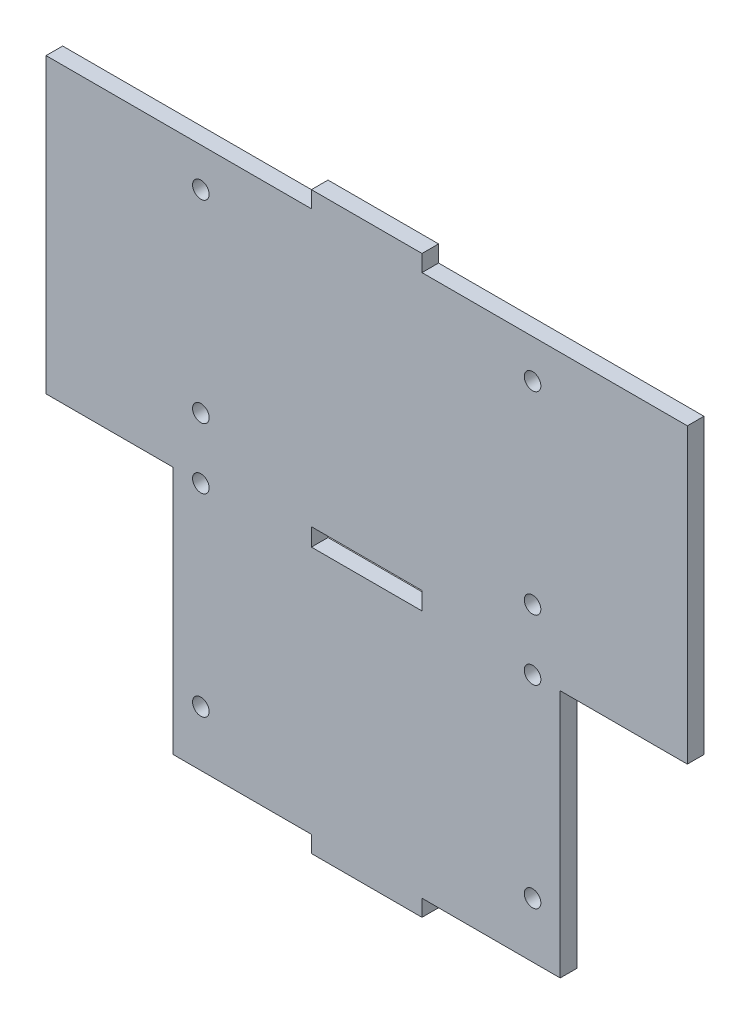
ISO-10303-21;
HEADER;
FILE_DESCRIPTION(('STEP AP214'),'2;1');
FILE_NAME('part.step','',(''),(''),'','','');
FILE_SCHEMA(('AUTOMOTIVE_DESIGN { 1 0 10303 214 1 1 1 1 }'));
ENDSEC;
DATA;
#1=APPLICATION_CONTEXT('core data for automotive mechanical design processes');
#2=APPLICATION_PROTOCOL_DEFINITION('international standard','automotive_design',2000,#1);
#3=PRODUCT_CONTEXT('',#1,'mechanical');
#4=PRODUCT('Part','Part','',(#3));
#5=PRODUCT_RELATED_PRODUCT_CATEGORY('part','',(#4));
#6=PRODUCT_DEFINITION_FORMATION('','',#4);
#7=PRODUCT_DEFINITION_CONTEXT('part definition',#1,'design');
#8=PRODUCT_DEFINITION('design','',#6,#7);
#9=PRODUCT_DEFINITION_SHAPE('','',#8);
#10=(LENGTH_UNIT() NAMED_UNIT(*) SI_UNIT(.MILLI.,.METRE.));
#11=(NAMED_UNIT(*) PLANE_ANGLE_UNIT() SI_UNIT($,.RADIAN.));
#12=(NAMED_UNIT(*) SI_UNIT($,.STERADIAN.) SOLID_ANGLE_UNIT());
#13=UNCERTAINTY_MEASURE_WITH_UNIT(LENGTH_MEASURE(1.E-05),#10,'distance_accuracy_value','');
#14=(GEOMETRIC_REPRESENTATION_CONTEXT(3) GLOBAL_UNCERTAINTY_ASSIGNED_CONTEXT((#13)) GLOBAL_UNIT_ASSIGNED_CONTEXT((#10,
#11,#12)) REPRESENTATION_CONTEXT('',''));
#15=CARTESIAN_POINT('',(0.,0.,0.));
#16=DIRECTION('',(0.,0.,1.));
#17=DIRECTION('',(1.,0.,0.));
#18=AXIS2_PLACEMENT_3D('',#15,#16,#17);
#19=CARTESIAN_POINT('',(0.,0.,3.));
#20=DIRECTION('',(0.,0.,-1.));
#21=DIRECTION('',(-1.,0.,0.));
#22=AXIS2_PLACEMENT_3D('',#19,#20,#21);
#23=PLANE('',#22);
#24=CARTESIAN_POINT('',(30.,11.,3.));
#25=DIRECTION('',(0.,0.,1.));
#26=DIRECTION('',(1.,0.,0.));
#27=AXIS2_PLACEMENT_3D('',#24,#25,#26);
#28=CIRCLE('',#27,1.50000000000002);
#29=CARTESIAN_POINT('',(31.5,11.,3.));
#30=VERTEX_POINT('',#29);
#31=EDGE_CURVE('E225',#30,#30,#28,.T.);
#32=ORIENTED_EDGE('',*,*,#31,.F.);
#33=EDGE_LOOP('',(#32));
#34=FACE_BOUND('',#33,.T.);
#35=CARTESIAN_POINT('',(30.,46.,3.));
#36=DIRECTION('',(0.,0.,1.));
#37=DIRECTION('',(1.,0.,0.));
#38=AXIS2_PLACEMENT_3D('',#35,#36,#37);
#39=CIRCLE('',#38,1.50000000000002);
#40=CARTESIAN_POINT('',(31.5,46.,3.));
#41=VERTEX_POINT('',#40);
#42=EDGE_CURVE('E233',#41,#41,#39,.T.);
#43=ORIENTED_EDGE('',*,*,#42,.F.);
#44=EDGE_LOOP('',(#43));
#45=FACE_BOUND('',#44,.T.);
#46=CARTESIAN_POINT('',(-30.,46.,3.));
#47=DIRECTION('',(0.,0.,1.));
#48=DIRECTION('',(1.,0.,0.));
#49=AXIS2_PLACEMENT_3D('',#46,#47,#48);
#50=CIRCLE('',#49,1.5);
#51=CARTESIAN_POINT('',(-28.5,46.,3.));
#52=VERTEX_POINT('',#51);
#53=EDGE_CURVE('E241',#52,#52,#50,.T.);
#54=ORIENTED_EDGE('',*,*,#53,.F.);
#55=EDGE_LOOP('',(#54));
#56=FACE_BOUND('',#55,.T.);
#57=CARTESIAN_POINT('',(-30.,11.,3.));
#58=DIRECTION('',(0.,0.,1.));
#59=DIRECTION('',(1.,0.,0.));
#60=AXIS2_PLACEMENT_3D('',#57,#58,#59);
#61=CIRCLE('',#60,1.5);
#62=CARTESIAN_POINT('',(-28.5,11.,3.));
#63=VERTEX_POINT('',#62);
#64=EDGE_CURVE('E249',#63,#63,#61,.T.);
#65=ORIENTED_EDGE('',*,*,#64,.F.);
#66=EDGE_LOOP('',(#65));
#67=FACE_BOUND('',#66,.T.);
#68=CARTESIAN_POINT('',(30.,-35.,3.));
#69=DIRECTION('',(0.,0.,1.));
#70=DIRECTION('',(1.,0.,0.));
#71=AXIS2_PLACEMENT_3D('',#68,#69,#70);
#72=CIRCLE('',#71,1.50000000000001);
#73=CARTESIAN_POINT('',(31.5,-35.,3.));
#74=VERTEX_POINT('',#73);
#75=EDGE_CURVE('E257',#74,#74,#72,.T.);
#76=ORIENTED_EDGE('',*,*,#75,.F.);
#77=EDGE_LOOP('',(#76));
#78=FACE_BOUND('',#77,.T.);
#79=CARTESIAN_POINT('',(30.,0.,3.));
#80=DIRECTION('',(0.,0.,1.));
#81=DIRECTION('',(1.,0.,0.));
#82=AXIS2_PLACEMENT_3D('',#79,#80,#81);
#83=CIRCLE('',#82,1.50000000000001);
#84=CARTESIAN_POINT('',(31.5,0.,3.));
#85=VERTEX_POINT('',#84);
#86=EDGE_CURVE('E265',#85,#85,#83,.T.);
#87=ORIENTED_EDGE('',*,*,#86,.F.);
#88=EDGE_LOOP('',(#87));
#89=FACE_BOUND('',#88,.T.);
#90=CARTESIAN_POINT('',(-30.,-35.,3.));
#91=DIRECTION('',(0.,0.,1.));
#92=DIRECTION('',(1.,0.,0.));
#93=AXIS2_PLACEMENT_3D('',#90,#91,#92);
#94=CIRCLE('',#93,1.5);
#95=CARTESIAN_POINT('',(-28.5,-35.,3.));
#96=VERTEX_POINT('',#95);
#97=EDGE_CURVE('E273',#96,#96,#94,.T.);
#98=ORIENTED_EDGE('',*,*,#97,.F.);
#99=EDGE_LOOP('',(#98));
#100=FACE_BOUND('',#99,.T.);
#101=CARTESIAN_POINT('',(-30.,0.,3.));
#102=DIRECTION('',(0.,0.,1.));
#103=DIRECTION('',(1.,0.,0.));
#104=AXIS2_PLACEMENT_3D('',#101,#102,#103);
#105=CIRCLE('',#104,1.5);
#106=CARTESIAN_POINT('',(-28.5,0.,3.));
#107=VERTEX_POINT('',#106);
#108=EDGE_CURVE('E281',#107,#107,#105,.T.);
#109=ORIENTED_EDGE('',*,*,#108,.F.);
#110=EDGE_LOOP('',(#109));
#111=FACE_BOUND('',#110,.T.);
#112=DIRECTION('',(0.,1.,0.));
#113=VECTOR('',#112,1.);
#114=CARTESIAN_POINT('',(10.,-45.,3.));
#115=LINE('',#114,#113);
#116=CARTESIAN_POINT('',(10.,-48.,3.));
#117=VERTEX_POINT('',#116);
#118=CARTESIAN_POINT('',(10.,-45.,3.));
#119=VERTEX_POINT('',#118);
#120=EDGE_CURVE('E289',#117,#119,#115,.T.);
#121=ORIENTED_EDGE('',*,*,#120,.T.);
#122=DIRECTION('',(1.,0.,0.));
#123=VECTOR('',#122,1.);
#124=CARTESIAN_POINT('',(35.,-45.,3.));
#125=LINE('',#124,#123);
#126=CARTESIAN_POINT('',(35.,-45.,3.));
#127=VERTEX_POINT('',#126);
#128=EDGE_CURVE('E293',#119,#127,#125,.T.);
#129=ORIENTED_EDGE('',*,*,#128,.T.);
#130=DIRECTION('',(0.,1.,0.));
#131=VECTOR('',#130,1.);
#132=CARTESIAN_POINT('',(35.,-45.,3.));
#133=LINE('',#132,#131);
#134=CARTESIAN_POINT('',(35.,0.,3.));
#135=VERTEX_POINT('',#134);
#136=EDGE_CURVE('E297',#127,#135,#133,.T.);
#137=ORIENTED_EDGE('',*,*,#136,.T.);
#138=DIRECTION('',(1.,0.,0.));
#139=VECTOR('',#138,1.);
#140=CARTESIAN_POINT('',(35.,0.,3.));
#141=LINE('',#140,#139);
#142=CARTESIAN_POINT('',(58.,0.,3.));
#143=VERTEX_POINT('',#142);
#144=EDGE_CURVE('E300',#135,#143,#141,.T.);
#145=ORIENTED_EDGE('',*,*,#144,.T.);
#146=DIRECTION('',(0.,1.,0.));
#147=VECTOR('',#146,1.);
#148=CARTESIAN_POINT('',(58.,0.,3.));
#149=LINE('',#148,#147);
#150=CARTESIAN_POINT('',(58.,53.,3.));
#151=VERTEX_POINT('',#150);
#152=EDGE_CURVE('E303',#143,#151,#149,.T.);
#153=ORIENTED_EDGE('',*,*,#152,.T.);
#154=DIRECTION('',(-1.,0.,0.));
#155=VECTOR('',#154,1.);
#156=CARTESIAN_POINT('',(10.,53.,3.));
#157=LINE('',#156,#155);
#158=CARTESIAN_POINT('',(10.,53.,3.));
#159=VERTEX_POINT('',#158);
#160=EDGE_CURVE('E306',#151,#159,#157,.T.);
#161=ORIENTED_EDGE('',*,*,#160,.T.);
#162=DIRECTION('',(0.,1.,0.));
#163=VECTOR('',#162,1.);
#164=CARTESIAN_POINT('',(10.,56.,3.));
#165=LINE('',#164,#163);
#166=CARTESIAN_POINT('',(10.,56.,3.));
#167=VERTEX_POINT('',#166);
#168=EDGE_CURVE('E309',#159,#167,#165,.T.);
#169=ORIENTED_EDGE('',*,*,#168,.T.);
#170=DIRECTION('',(-1.,0.,0.));
#171=VECTOR('',#170,1.);
#172=CARTESIAN_POINT('',(-10.,56.,3.));
#173=LINE('',#172,#171);
#174=CARTESIAN_POINT('',(-10.,56.,3.));
#175=VERTEX_POINT('',#174);
#176=EDGE_CURVE('E312',#167,#175,#173,.T.);
#177=ORIENTED_EDGE('',*,*,#176,.T.);
#178=DIRECTION('',(0.,-1.,0.));
#179=VECTOR('',#178,1.);
#180=CARTESIAN_POINT('',(-10.,53.,3.));
#181=LINE('',#180,#179);
#182=CARTESIAN_POINT('',(-10.,53.,3.));
#183=VERTEX_POINT('',#182);
#184=EDGE_CURVE('E315',#175,#183,#181,.T.);
#185=ORIENTED_EDGE('',*,*,#184,.T.);
#186=DIRECTION('',(-1.,0.,0.));
#187=VECTOR('',#186,1.);
#188=CARTESIAN_POINT('',(-58.,53.,3.));
#189=LINE('',#188,#187);
#190=CARTESIAN_POINT('',(-58.,53.,3.));
#191=VERTEX_POINT('',#190);
#192=EDGE_CURVE('E318',#183,#191,#189,.T.);
#193=ORIENTED_EDGE('',*,*,#192,.T.);
#194=DIRECTION('',(0.,-1.,0.));
#195=VECTOR('',#194,1.);
#196=CARTESIAN_POINT('',(-58.,0.,3.));
#197=LINE('',#196,#195);
#198=CARTESIAN_POINT('',(-58.,0.,3.));
#199=VERTEX_POINT('',#198);
#200=EDGE_CURVE('E321',#191,#199,#197,.T.);
#201=ORIENTED_EDGE('',*,*,#200,.T.);
#202=DIRECTION('',(1.,0.,0.));
#203=VECTOR('',#202,1.);
#204=CARTESIAN_POINT('',(-35.,0.,3.));
#205=LINE('',#204,#203);
#206=CARTESIAN_POINT('',(-35.,0.,3.));
#207=VERTEX_POINT('',#206);
#208=EDGE_CURVE('E324',#199,#207,#205,.T.);
#209=ORIENTED_EDGE('',*,*,#208,.T.);
#210=DIRECTION('',(0.,-1.,0.));
#211=VECTOR('',#210,1.);
#212=CARTESIAN_POINT('',(-35.,-45.,3.));
#213=LINE('',#212,#211);
#214=CARTESIAN_POINT('',(-35.,-45.,3.));
#215=VERTEX_POINT('',#214);
#216=EDGE_CURVE('E327',#207,#215,#213,.T.);
#217=ORIENTED_EDGE('',*,*,#216,.T.);
#218=DIRECTION('',(1.,0.,0.));
#219=VECTOR('',#218,1.);
#220=CARTESIAN_POINT('',(-10.,-45.,3.));
#221=LINE('',#220,#219);
#222=CARTESIAN_POINT('',(-10.,-45.,3.));
#223=VERTEX_POINT('',#222);
#224=EDGE_CURVE('E330',#215,#223,#221,.T.);
#225=ORIENTED_EDGE('',*,*,#224,.T.);
#226=DIRECTION('',(0.,-1.,0.));
#227=VECTOR('',#226,1.);
#228=CARTESIAN_POINT('',(-10.,-48.,3.));
#229=LINE('',#228,#227);
#230=CARTESIAN_POINT('',(-10.,-48.,3.));
#231=VERTEX_POINT('',#230);
#232=EDGE_CURVE('E333',#223,#231,#229,.T.);
#233=ORIENTED_EDGE('',*,*,#232,.T.);
#234=DIRECTION('',(1.,0.,0.));
#235=VECTOR('',#234,1.);
#236=CARTESIAN_POINT('',(10.,-48.,3.));
#237=LINE('',#236,#235);
#238=EDGE_CURVE('E336',#231,#117,#237,.T.);
#239=ORIENTED_EDGE('',*,*,#238,.T.);
#240=EDGE_LOOP('',(#121,#129,#137,#145,#153,#161,#169,#177,#185,#193,#201,#209,#217,#225,#233,#239));
#241=FACE_BOUND('',#240,.T.);
#242=DIRECTION('',(0.,1.,0.));
#243=VECTOR('',#242,1.);
#244=CARTESIAN_POINT('',(10.,3.2,3.));
#245=LINE('',#244,#243);
#246=CARTESIAN_POINT('',(9.99999999999999,0.,3.));
#247=VERTEX_POINT('',#246);
#248=CARTESIAN_POINT('',(10.,3.2,3.));
#249=VERTEX_POINT('',#248);
#250=EDGE_CURVE('E177',#247,#249,#245,.T.);
#251=ORIENTED_EDGE('',*,*,#250,.F.);
#252=DIRECTION('',(1.,0.,0.));
#253=VECTOR('',#252,1.);
#254=CARTESIAN_POINT('',(-10.,0.,3.));
#255=LINE('',#254,#253);
#256=CARTESIAN_POINT('',(-10.,0.,3.));
#257=VERTEX_POINT('',#256);
#258=EDGE_CURVE('E203',#257,#247,#255,.T.);
#259=ORIENTED_EDGE('',*,*,#258,.F.);
#260=DIRECTION('',(0.,-1.,0.));
#261=VECTOR('',#260,1.);
#262=CARTESIAN_POINT('',(-10.,3.2,3.));
#263=LINE('',#262,#261);
#264=CARTESIAN_POINT('',(-10.,3.2,3.));
#265=VERTEX_POINT('',#264);
#266=EDGE_CURVE('E199',#265,#257,#263,.T.);
#267=ORIENTED_EDGE('',*,*,#266,.F.);
#268=DIRECTION('',(-1.,0.,0.));
#269=VECTOR('',#268,1.);
#270=CARTESIAN_POINT('',(-10.,3.2,3.));
#271=LINE('',#270,#269);
#272=EDGE_CURVE('E186',#249,#265,#271,.T.);
#273=ORIENTED_EDGE('',*,*,#272,.F.);
#274=EDGE_LOOP('',(#251,#259,#267,#273));
#275=FACE_BOUND('',#274,.T.);
#276=ADVANCED_FACE('F39',(#34,#45,#56,#67,#78,#89,#100,#111,#241,#275),#23,.F.);
#277=CARTESIAN_POINT('',(0.,0.,0.));
#278=DIRECTION('',(0.,0.,-1.));
#279=DIRECTION('',(-1.,0.,0.));
#280=AXIS2_PLACEMENT_3D('',#277,#278,#279);
#281=PLANE('',#280);
#282=CARTESIAN_POINT('',(30.,46.,0.));
#283=DIRECTION('',(0.,0.,1.));
#284=DIRECTION('',(1.,0.,0.));
#285=AXIS2_PLACEMENT_3D('',#282,#283,#284);
#286=CIRCLE('',#285,1.50000000000002);
#287=CARTESIAN_POINT('',(31.5,46.,0.));
#288=VERTEX_POINT('',#287);
#289=EDGE_CURVE('E229',#288,#288,#286,.T.);
#290=ORIENTED_EDGE('',*,*,#289,.T.);
#291=EDGE_LOOP('',(#290));
#292=FACE_BOUND('',#291,.T.);
#293=CARTESIAN_POINT('',(-30.,11.,0.));
#294=DIRECTION('',(0.,0.,1.));
#295=DIRECTION('',(1.,0.,0.));
#296=AXIS2_PLACEMENT_3D('',#293,#294,#295);
#297=CIRCLE('',#296,1.5);
#298=CARTESIAN_POINT('',(-28.5,11.,0.));
#299=VERTEX_POINT('',#298);
#300=EDGE_CURVE('E245',#299,#299,#297,.T.);
#301=ORIENTED_EDGE('',*,*,#300,.T.);
#302=EDGE_LOOP('',(#301));
#303=FACE_BOUND('',#302,.T.);
#304=CARTESIAN_POINT('',(30.,0.,0.));
#305=DIRECTION('',(0.,0.,1.));
#306=DIRECTION('',(1.,0.,0.));
#307=AXIS2_PLACEMENT_3D('',#304,#305,#306);
#308=CIRCLE('',#307,1.50000000000001);
#309=CARTESIAN_POINT('',(31.5,0.,0.));
#310=VERTEX_POINT('',#309);
#311=EDGE_CURVE('E261',#310,#310,#308,.T.);
#312=ORIENTED_EDGE('',*,*,#311,.T.);
#313=EDGE_LOOP('',(#312));
#314=FACE_BOUND('',#313,.T.);
#315=CARTESIAN_POINT('',(-30.,0.,0.));
#316=DIRECTION('',(0.,0.,1.));
#317=DIRECTION('',(1.,0.,0.));
#318=AXIS2_PLACEMENT_3D('',#315,#316,#317);
#319=CIRCLE('',#318,1.5);
#320=CARTESIAN_POINT('',(-28.5,0.,0.));
#321=VERTEX_POINT('',#320);
#322=EDGE_CURVE('E277',#321,#321,#319,.T.);
#323=ORIENTED_EDGE('',*,*,#322,.T.);
#324=EDGE_LOOP('',(#323));
#325=FACE_BOUND('',#324,.T.);
#326=DIRECTION('',(0.,1.,0.));
#327=VECTOR('',#326,1.);
#328=CARTESIAN_POINT('',(10.,-45.,0.));
#329=LINE('',#328,#327);
#330=CARTESIAN_POINT('',(10.,-48.,0.));
#331=VERTEX_POINT('',#330);
#332=CARTESIAN_POINT('',(10.,-45.,0.));
#333=VERTEX_POINT('',#332);
#334=EDGE_CURVE('E285',#331,#333,#329,.T.);
#335=ORIENTED_EDGE('',*,*,#334,.F.);
#336=DIRECTION('',(1.,0.,0.));
#337=VECTOR('',#336,1.);
#338=CARTESIAN_POINT('',(10.,-48.,0.));
#339=LINE('',#338,#337);
#340=CARTESIAN_POINT('',(-10.,-48.,0.));
#341=VERTEX_POINT('',#340);
#342=EDGE_CURVE('E294',#341,#331,#339,.T.);
#343=ORIENTED_EDGE('',*,*,#342,.F.);
#344=DIRECTION('',(0.,-1.,0.));
#345=VECTOR('',#344,1.);
#346=CARTESIAN_POINT('',(-10.,-48.,0.));
#347=LINE('',#346,#345);
#348=CARTESIAN_POINT('',(-10.,-45.,0.));
#349=VERTEX_POINT('',#348);
#350=EDGE_CURVE('E382',#349,#341,#347,.T.);
#351=ORIENTED_EDGE('',*,*,#350,.F.);
#352=DIRECTION('',(1.,0.,0.));
#353=VECTOR('',#352,1.);
#354=CARTESIAN_POINT('',(-10.,-45.,0.));
#355=LINE('',#354,#353);
#356=CARTESIAN_POINT('',(-35.,-45.,0.));
#357=VERTEX_POINT('',#356);
#358=EDGE_CURVE('E379',#357,#349,#355,.T.);
#359=ORIENTED_EDGE('',*,*,#358,.F.);
#360=DIRECTION('',(0.,-1.,0.));
#361=VECTOR('',#360,1.);
#362=CARTESIAN_POINT('',(-35.,-45.,0.));
#363=LINE('',#362,#361);
#364=CARTESIAN_POINT('',(-35.,0.,0.));
#365=VERTEX_POINT('',#364);
#366=EDGE_CURVE('E376',#365,#357,#363,.T.);
#367=ORIENTED_EDGE('',*,*,#366,.F.);
#368=DIRECTION('',(1.,0.,0.));
#369=VECTOR('',#368,1.);
#370=CARTESIAN_POINT('',(-35.,0.,0.));
#371=LINE('',#370,#369);
#372=CARTESIAN_POINT('',(-58.,0.,0.));
#373=VERTEX_POINT('',#372);
#374=EDGE_CURVE('E373',#373,#365,#371,.T.);
#375=ORIENTED_EDGE('',*,*,#374,.F.);
#376=DIRECTION('',(0.,-1.,0.));
#377=VECTOR('',#376,1.);
#378=CARTESIAN_POINT('',(-58.,0.,0.));
#379=LINE('',#378,#377);
#380=CARTESIAN_POINT('',(-58.,53.,0.));
#381=VERTEX_POINT('',#380);
#382=EDGE_CURVE('E370',#381,#373,#379,.T.);
#383=ORIENTED_EDGE('',*,*,#382,.F.);
#384=DIRECTION('',(-1.,0.,0.));
#385=VECTOR('',#384,1.);
#386=CARTESIAN_POINT('',(-58.,53.,0.));
#387=LINE('',#386,#385);
#388=CARTESIAN_POINT('',(-10.,53.,0.));
#389=VERTEX_POINT('',#388);
#390=EDGE_CURVE('E367',#389,#381,#387,.T.);
#391=ORIENTED_EDGE('',*,*,#390,.F.);
#392=DIRECTION('',(0.,-1.,0.));
#393=VECTOR('',#392,1.);
#394=CARTESIAN_POINT('',(-10.,53.,0.));
#395=LINE('',#394,#393);
#396=CARTESIAN_POINT('',(-10.,56.,0.));
#397=VERTEX_POINT('',#396);
#398=EDGE_CURVE('E364',#397,#389,#395,.T.);
#399=ORIENTED_EDGE('',*,*,#398,.F.);
#400=DIRECTION('',(-1.,0.,0.));
#401=VECTOR('',#400,1.);
#402=CARTESIAN_POINT('',(-10.,56.,0.));
#403=LINE('',#402,#401);
#404=CARTESIAN_POINT('',(10.,56.,0.));
#405=VERTEX_POINT('',#404);
#406=EDGE_CURVE('E361',#405,#397,#403,.T.);
#407=ORIENTED_EDGE('',*,*,#406,.F.);
#408=DIRECTION('',(0.,1.,0.));
#409=VECTOR('',#408,1.);
#410=CARTESIAN_POINT('',(10.,56.,0.));
#411=LINE('',#410,#409);
#412=CARTESIAN_POINT('',(10.,53.,0.));
#413=VERTEX_POINT('',#412);
#414=EDGE_CURVE('E358',#413,#405,#411,.T.);
#415=ORIENTED_EDGE('',*,*,#414,.F.);
#416=DIRECTION('',(-1.,0.,0.));
#417=VECTOR('',#416,1.);
#418=CARTESIAN_POINT('',(10.,53.,0.));
#419=LINE('',#418,#417);
#420=CARTESIAN_POINT('',(58.,53.,0.));
#421=VERTEX_POINT('',#420);
#422=EDGE_CURVE('E355',#421,#413,#419,.T.);
#423=ORIENTED_EDGE('',*,*,#422,.F.);
#424=DIRECTION('',(0.,1.,0.));
#425=VECTOR('',#424,1.);
#426=CARTESIAN_POINT('',(58.,0.,0.));
#427=LINE('',#426,#425);
#428=CARTESIAN_POINT('',(58.,0.,0.));
#429=VERTEX_POINT('',#428);
#430=EDGE_CURVE('E352',#429,#421,#427,.T.);
#431=ORIENTED_EDGE('',*,*,#430,.F.);
#432=DIRECTION('',(1.,0.,0.));
#433=VECTOR('',#432,1.);
#434=CARTESIAN_POINT('',(35.,0.,0.));
#435=LINE('',#434,#433);
#436=CARTESIAN_POINT('',(35.,0.,0.));
#437=VERTEX_POINT('',#436);
#438=EDGE_CURVE('E349',#437,#429,#435,.T.);
#439=ORIENTED_EDGE('',*,*,#438,.F.);
#440=DIRECTION('',(0.,1.,0.));
#441=VECTOR('',#440,1.);
#442=CARTESIAN_POINT('',(35.,-45.,0.));
#443=LINE('',#442,#441);
#444=CARTESIAN_POINT('',(35.,-45.,0.));
#445=VERTEX_POINT('',#444);
#446=EDGE_CURVE('E346',#445,#437,#443,.T.);
#447=ORIENTED_EDGE('',*,*,#446,.F.);
#448=DIRECTION('',(1.,0.,0.));
#449=VECTOR('',#448,1.);
#450=CARTESIAN_POINT('',(35.,-45.,0.));
#451=LINE('',#450,#449);
#452=EDGE_CURVE('E343',#333,#445,#451,.T.);
#453=ORIENTED_EDGE('',*,*,#452,.F.);
#454=EDGE_LOOP('',(#335,#343,#351,#359,#367,#375,#383,#391,#399,#407,#415,#423,#431,#439,#447,#453));
#455=FACE_BOUND('',#454,.T.);
#456=CARTESIAN_POINT('',(-30.,-35.,0.));
#457=DIRECTION('',(0.,0.,1.));
#458=DIRECTION('',(1.,0.,0.));
#459=AXIS2_PLACEMENT_3D('',#456,#457,#458);
#460=CIRCLE('',#459,1.5);
#461=CARTESIAN_POINT('',(-28.5,-35.,0.));
#462=VERTEX_POINT('',#461);
#463=EDGE_CURVE('E269',#462,#462,#460,.T.);
#464=ORIENTED_EDGE('',*,*,#463,.T.);
#465=EDGE_LOOP('',(#464));
#466=FACE_BOUND('',#465,.T.);
#467=CARTESIAN_POINT('',(30.,-35.,0.));
#468=DIRECTION('',(0.,0.,1.));
#469=DIRECTION('',(1.,0.,0.));
#470=AXIS2_PLACEMENT_3D('',#467,#468,#469);
#471=CIRCLE('',#470,1.50000000000001);
#472=CARTESIAN_POINT('',(31.5,-35.,0.));
#473=VERTEX_POINT('',#472);
#474=EDGE_CURVE('E253',#473,#473,#471,.T.);
#475=ORIENTED_EDGE('',*,*,#474,.T.);
#476=EDGE_LOOP('',(#475));
#477=FACE_BOUND('',#476,.T.);
#478=CARTESIAN_POINT('',(-30.,46.,0.));
#479=DIRECTION('',(0.,0.,1.));
#480=DIRECTION('',(1.,0.,0.));
#481=AXIS2_PLACEMENT_3D('',#478,#479,#480);
#482=CIRCLE('',#481,1.5);
#483=CARTESIAN_POINT('',(-28.5,46.,0.));
#484=VERTEX_POINT('',#483);
#485=EDGE_CURVE('E237',#484,#484,#482,.T.);
#486=ORIENTED_EDGE('',*,*,#485,.T.);
#487=EDGE_LOOP('',(#486));
#488=FACE_BOUND('',#487,.T.);
#489=CARTESIAN_POINT('',(30.,11.,0.));
#490=DIRECTION('',(0.,0.,1.));
#491=DIRECTION('',(1.,0.,0.));
#492=AXIS2_PLACEMENT_3D('',#489,#490,#491);
#493=CIRCLE('',#492,1.50000000000002);
#494=CARTESIAN_POINT('',(31.5,11.,0.));
#495=VERTEX_POINT('',#494);
#496=EDGE_CURVE('E195',#495,#495,#493,.T.);
#497=ORIENTED_EDGE('',*,*,#496,.T.);
#498=EDGE_LOOP('',(#497));
#499=FACE_BOUND('',#498,.T.);
#500=DIRECTION('',(1.,0.,0.));
#501=VECTOR('',#500,1.);
#502=CARTESIAN_POINT('',(-10.,0.,0.));
#503=LINE('',#502,#501);
#504=CARTESIAN_POINT('',(-10.,0.,0.));
#505=VERTEX_POINT('',#504);
#506=CARTESIAN_POINT('',(9.99999999999999,0.,0.));
#507=VERTEX_POINT('',#506);
#508=EDGE_CURVE('E187',#505,#507,#503,.T.);
#509=ORIENTED_EDGE('',*,*,#508,.T.);
#510=DIRECTION('',(0.,1.,0.));
#511=VECTOR('',#510,1.);
#512=CARTESIAN_POINT('',(10.,3.2,0.));
#513=LINE('',#512,#511);
#514=CARTESIAN_POINT('',(10.,3.2,0.));
#515=VERTEX_POINT('',#514);
#516=EDGE_CURVE('E63',#507,#515,#513,.T.);
#517=ORIENTED_EDGE('',*,*,#516,.T.);
#518=DIRECTION('',(-1.,0.,0.));
#519=VECTOR('',#518,1.);
#520=CARTESIAN_POINT('',(-10.,3.2,0.));
#521=LINE('',#520,#519);
#522=CARTESIAN_POINT('',(-10.,3.2,0.));
#523=VERTEX_POINT('',#522);
#524=EDGE_CURVE('E193',#515,#523,#521,.T.);
#525=ORIENTED_EDGE('',*,*,#524,.T.);
#526=DIRECTION('',(0.,-1.,0.));
#527=VECTOR('',#526,1.);
#528=CARTESIAN_POINT('',(-10.,3.2,0.));
#529=LINE('',#528,#527);
#530=EDGE_CURVE('E212',#523,#505,#529,.T.);
#531=ORIENTED_EDGE('',*,*,#530,.T.);
#532=EDGE_LOOP('',(#509,#517,#525,#531));
#533=FACE_BOUND('',#532,.T.);
#534=ADVANCED_FACE('F453',(#292,#303,#314,#325,#455,#466,#477,#488,#499,#533),#281,.T.);
#535=CARTESIAN_POINT('',(10.,-45.,3.));
#536=DIRECTION('',(-1.,0.,0.));
#537=DIRECTION('',(0.,0.,1.));
#538=AXIS2_PLACEMENT_3D('',#535,#536,#537);
#539=PLANE('',#538);
#540=ORIENTED_EDGE('',*,*,#334,.T.);
#541=DIRECTION('',(0.,0.,-1.));
#542=VECTOR('',#541,1.);
#543=CARTESIAN_POINT('',(10.,-45.,3.));
#544=LINE('',#543,#542);
#545=EDGE_CURVE('E11',#119,#333,#544,.T.);
#546=ORIENTED_EDGE('',*,*,#545,.F.);
#547=ORIENTED_EDGE('',*,*,#120,.F.);
#548=DIRECTION('',(0.,0.,-1.));
#549=VECTOR('',#548,1.);
#550=CARTESIAN_POINT('',(10.,-48.,3.));
#551=LINE('',#550,#549);
#552=EDGE_CURVE('E339',#117,#331,#551,.T.);
#553=ORIENTED_EDGE('',*,*,#552,.T.);
#554=EDGE_LOOP('',(#540,#546,#547,#553));
#555=FACE_BOUND('',#554,.T.);
#556=ADVANCED_FACE('F41',(#555),#539,.F.);
#557=CARTESIAN_POINT('',(35.,-45.,3.));
#558=DIRECTION('',(0.,1.,0.));
#559=DIRECTION('',(-1.,0.,0.));
#560=AXIS2_PLACEMENT_3D('',#557,#558,#559);
#561=PLANE('',#560);
#562=ORIENTED_EDGE('',*,*,#452,.T.);
#563=DIRECTION('',(0.,0.,-1.));
#564=VECTOR('',#563,1.);
#565=CARTESIAN_POINT('',(35.,-45.,3.));
#566=LINE('',#565,#564);
#567=EDGE_CURVE('E48',#127,#445,#566,.T.);
#568=ORIENTED_EDGE('',*,*,#567,.F.);
#569=ORIENTED_EDGE('',*,*,#128,.F.);
#570=ORIENTED_EDGE('',*,*,#545,.T.);
#571=EDGE_LOOP('',(#562,#568,#569,#570));
#572=FACE_BOUND('',#571,.T.);
#573=ADVANCED_FACE('F470',(#572),#561,.F.);
#574=CARTESIAN_POINT('',(35.,-45.,3.));
#575=DIRECTION('',(-1.,0.,0.));
#576=DIRECTION('',(0.,0.,1.));
#577=AXIS2_PLACEMENT_3D('',#574,#575,#576);
#578=PLANE('',#577);
#579=ORIENTED_EDGE('',*,*,#446,.T.);
#580=DIRECTION('',(0.,0.,-1.));
#581=VECTOR('',#580,1.);
#582=CARTESIAN_POINT('',(35.,0.,3.));
#583=LINE('',#582,#581);
#584=EDGE_CURVE('E438',#135,#437,#583,.T.);
#585=ORIENTED_EDGE('',*,*,#584,.F.);
#586=ORIENTED_EDGE('',*,*,#136,.F.);
#587=ORIENTED_EDGE('',*,*,#567,.T.);
#588=EDGE_LOOP('',(#579,#585,#586,#587));
#589=FACE_BOUND('',#588,.T.);
#590=ADVANCED_FACE('F447',(#589),#578,.F.);
#591=CARTESIAN_POINT('',(35.,0.,3.));
#592=DIRECTION('',(0.,1.,0.));
#593=DIRECTION('',(-1.,0.,0.));
#594=AXIS2_PLACEMENT_3D('',#591,#592,#593);
#595=PLANE('',#594);
#596=ORIENTED_EDGE('',*,*,#438,.T.);
#597=DIRECTION('',(0.,0.,-1.));
#598=VECTOR('',#597,1.);
#599=CARTESIAN_POINT('',(58.,0.,3.));
#600=LINE('',#599,#598);
#601=EDGE_CURVE('E434',#143,#429,#600,.T.);
#602=ORIENTED_EDGE('',*,*,#601,.F.);
#603=ORIENTED_EDGE('',*,*,#144,.F.);
#604=ORIENTED_EDGE('',*,*,#584,.T.);
#605=EDGE_LOOP('',(#596,#602,#603,#604));
#606=FACE_BOUND('',#605,.T.);
#607=ADVANCED_FACE('F459',(#606),#595,.F.);
#608=CARTESIAN_POINT('',(58.,0.,3.));
#609=DIRECTION('',(-1.,0.,0.));
#610=DIRECTION('',(0.,0.,1.));
#611=AXIS2_PLACEMENT_3D('',#608,#609,#610);
#612=PLANE('',#611);
#613=ORIENTED_EDGE('',*,*,#430,.T.);
#614=DIRECTION('',(0.,0.,-1.));
#615=VECTOR('',#614,1.);
#616=CARTESIAN_POINT('',(58.,53.,3.));
#617=LINE('',#616,#615);
#618=EDGE_CURVE('E430',#151,#421,#617,.T.);
#619=ORIENTED_EDGE('',*,*,#618,.F.);
#620=ORIENTED_EDGE('',*,*,#152,.F.);
#621=ORIENTED_EDGE('',*,*,#601,.T.);
#622=EDGE_LOOP('',(#613,#619,#620,#621));
#623=FACE_BOUND('',#622,.T.);
#624=ADVANCED_FACE('F463',(#623),#612,.F.);
#625=CARTESIAN_POINT('',(10.,53.,3.));
#626=DIRECTION('',(0.,-1.,0.));
#627=DIRECTION('',(0.,0.,-1.));
#628=AXIS2_PLACEMENT_3D('',#625,#626,#627);
#629=PLANE('',#628);
#630=ORIENTED_EDGE('',*,*,#422,.T.);
#631=DIRECTION('',(0.,0.,-1.));
#632=VECTOR('',#631,1.);
#633=CARTESIAN_POINT('',(10.,53.,3.));
#634=LINE('',#633,#632);
#635=EDGE_CURVE('E426',#159,#413,#634,.T.);
#636=ORIENTED_EDGE('',*,*,#635,.F.);
#637=ORIENTED_EDGE('',*,*,#160,.F.);
#638=ORIENTED_EDGE('',*,*,#618,.T.);
#639=EDGE_LOOP('',(#630,#636,#637,#638));
#640=FACE_BOUND('',#639,.T.);
#641=ADVANCED_FACE('F523',(#640),#629,.F.);
#642=CARTESIAN_POINT('',(10.,56.,3.));
#643=DIRECTION('',(-1.,0.,0.));
#644=DIRECTION('',(0.,0.,1.));
#645=AXIS2_PLACEMENT_3D('',#642,#643,#644);
#646=PLANE('',#645);
#647=ORIENTED_EDGE('',*,*,#414,.T.);
#648=DIRECTION('',(0.,0.,-1.));
#649=VECTOR('',#648,1.);
#650=CARTESIAN_POINT('',(10.,56.,3.));
#651=LINE('',#650,#649);
#652=EDGE_CURVE('E422',#167,#405,#651,.T.);
#653=ORIENTED_EDGE('',*,*,#652,.F.);
#654=ORIENTED_EDGE('',*,*,#168,.F.);
#655=ORIENTED_EDGE('',*,*,#635,.T.);
#656=EDGE_LOOP('',(#647,#653,#654,#655));
#657=FACE_BOUND('',#656,.T.);
#658=ADVANCED_FACE('F520',(#657),#646,.F.);
#659=CARTESIAN_POINT('',(-10.,56.,3.));
#660=DIRECTION('',(0.,-1.,0.));
#661=DIRECTION('',(0.,0.,-1.));
#662=AXIS2_PLACEMENT_3D('',#659,#660,#661);
#663=PLANE('',#662);
#664=ORIENTED_EDGE('',*,*,#406,.T.);
#665=DIRECTION('',(0.,0.,-1.));
#666=VECTOR('',#665,1.);
#667=CARTESIAN_POINT('',(-10.,56.,3.));
#668=LINE('',#667,#666);
#669=EDGE_CURVE('E418',#175,#397,#668,.T.);
#670=ORIENTED_EDGE('',*,*,#669,.F.);
#671=ORIENTED_EDGE('',*,*,#176,.F.);
#672=ORIENTED_EDGE('',*,*,#652,.T.);
#673=EDGE_LOOP('',(#664,#670,#671,#672));
#674=FACE_BOUND('',#673,.T.);
#675=ADVANCED_FACE('F516',(#674),#663,.F.);
#676=CARTESIAN_POINT('',(-10.,53.,3.));
#677=DIRECTION('',(1.,0.,0.));
#678=DIRECTION('',(0.,0.,-1.));
#679=AXIS2_PLACEMENT_3D('',#676,#677,#678);
#680=PLANE('',#679);
#681=ORIENTED_EDGE('',*,*,#398,.T.);
#682=DIRECTION('',(0.,0.,-1.));
#683=VECTOR('',#682,1.);
#684=CARTESIAN_POINT('',(-10.,53.,3.));
#685=LINE('',#684,#683);
#686=EDGE_CURVE('E414',#183,#389,#685,.T.);
#687=ORIENTED_EDGE('',*,*,#686,.F.);
#688=ORIENTED_EDGE('',*,*,#184,.F.);
#689=ORIENTED_EDGE('',*,*,#669,.T.);
#690=EDGE_LOOP('',(#681,#687,#688,#689));
#691=FACE_BOUND('',#690,.T.);
#692=ADVANCED_FACE('F512',(#691),#680,.F.);
#693=CARTESIAN_POINT('',(-58.,53.,3.));
#694=DIRECTION('',(0.,-1.,0.));
#695=DIRECTION('',(0.,0.,-1.));
#696=AXIS2_PLACEMENT_3D('',#693,#694,#695);
#697=PLANE('',#696);
#698=ORIENTED_EDGE('',*,*,#390,.T.);
#699=DIRECTION('',(0.,0.,-1.));
#700=VECTOR('',#699,1.);
#701=CARTESIAN_POINT('',(-58.,53.,3.));
#702=LINE('',#701,#700);
#703=EDGE_CURVE('E410',#191,#381,#702,.T.);
#704=ORIENTED_EDGE('',*,*,#703,.F.);
#705=ORIENTED_EDGE('',*,*,#192,.F.);
#706=ORIENTED_EDGE('',*,*,#686,.T.);
#707=EDGE_LOOP('',(#698,#704,#705,#706));
#708=FACE_BOUND('',#707,.T.);
#709=ADVANCED_FACE('F507',(#708),#697,.F.);
#710=CARTESIAN_POINT('',(-58.,0.,3.));
#711=DIRECTION('',(1.,0.,0.));
#712=DIRECTION('',(0.,0.,-1.));
#713=AXIS2_PLACEMENT_3D('',#710,#711,#712);
#714=PLANE('',#713);
#715=ORIENTED_EDGE('',*,*,#382,.T.);
#716=DIRECTION('',(0.,0.,-1.));
#717=VECTOR('',#716,1.);
#718=CARTESIAN_POINT('',(-58.,0.,3.));
#719=LINE('',#718,#717);
#720=EDGE_CURVE('E406',#199,#373,#719,.T.);
#721=ORIENTED_EDGE('',*,*,#720,.F.);
#722=ORIENTED_EDGE('',*,*,#200,.F.);
#723=ORIENTED_EDGE('',*,*,#703,.T.);
#724=EDGE_LOOP('',(#715,#721,#722,#723));
#725=FACE_BOUND('',#724,.T.);
#726=ADVANCED_FACE('F501',(#725),#714,.F.);
#727=CARTESIAN_POINT('',(-35.,0.,3.));
#728=DIRECTION('',(0.,1.,0.));
#729=DIRECTION('',(-1.,0.,0.));
#730=AXIS2_PLACEMENT_3D('',#727,#728,#729);
#731=PLANE('',#730);
#732=ORIENTED_EDGE('',*,*,#374,.T.);
#733=DIRECTION('',(0.,0.,-1.));
#734=VECTOR('',#733,1.);
#735=CARTESIAN_POINT('',(-35.,0.,3.));
#736=LINE('',#735,#734);
#737=EDGE_CURVE('E402',#207,#365,#736,.T.);
#738=ORIENTED_EDGE('',*,*,#737,.F.);
#739=ORIENTED_EDGE('',*,*,#208,.F.);
#740=ORIENTED_EDGE('',*,*,#720,.T.);
#741=EDGE_LOOP('',(#732,#738,#739,#740));
#742=FACE_BOUND('',#741,.T.);
#743=ADVANCED_FACE('F497',(#742),#731,.F.);
#744=CARTESIAN_POINT('',(-35.,-45.,3.));
#745=DIRECTION('',(1.,0.,0.));
#746=DIRECTION('',(0.,0.,-1.));
#747=AXIS2_PLACEMENT_3D('',#744,#745,#746);
#748=PLANE('',#747);
#749=ORIENTED_EDGE('',*,*,#366,.T.);
#750=DIRECTION('',(0.,0.,-1.));
#751=VECTOR('',#750,1.);
#752=CARTESIAN_POINT('',(-35.,-45.,3.));
#753=LINE('',#752,#751);
#754=EDGE_CURVE('E398',#215,#357,#753,.T.);
#755=ORIENTED_EDGE('',*,*,#754,.F.);
#756=ORIENTED_EDGE('',*,*,#216,.F.);
#757=ORIENTED_EDGE('',*,*,#737,.T.);
#758=EDGE_LOOP('',(#749,#755,#756,#757));
#759=FACE_BOUND('',#758,.T.);
#760=ADVANCED_FACE('F492',(#759),#748,.F.);
#761=CARTESIAN_POINT('',(-10.,-45.,3.));
#762=DIRECTION('',(0.,1.,0.));
#763=DIRECTION('',(-1.,0.,0.));
#764=AXIS2_PLACEMENT_3D('',#761,#762,#763);
#765=PLANE('',#764);
#766=ORIENTED_EDGE('',*,*,#358,.T.);
#767=DIRECTION('',(0.,0.,-1.));
#768=VECTOR('',#767,1.);
#769=CARTESIAN_POINT('',(-10.,-45.,3.));
#770=LINE('',#769,#768);
#771=EDGE_CURVE('E394',#223,#349,#770,.T.);
#772=ORIENTED_EDGE('',*,*,#771,.F.);
#773=ORIENTED_EDGE('',*,*,#224,.F.);
#774=ORIENTED_EDGE('',*,*,#754,.T.);
#775=EDGE_LOOP('',(#766,#772,#773,#774));
#776=FACE_BOUND('',#775,.T.);
#777=ADVANCED_FACE('F486',(#776),#765,.F.);
#778=CARTESIAN_POINT('',(-10.,-48.,3.));
#779=DIRECTION('',(1.,0.,0.));
#780=DIRECTION('',(0.,0.,-1.));
#781=AXIS2_PLACEMENT_3D('',#778,#779,#780);
#782=PLANE('',#781);
#783=ORIENTED_EDGE('',*,*,#350,.T.);
#784=DIRECTION('',(0.,0.,-1.));
#785=VECTOR('',#784,1.);
#786=CARTESIAN_POINT('',(-10.,-48.,3.));
#787=LINE('',#786,#785);
#788=EDGE_CURVE('E390',#231,#341,#787,.T.);
#789=ORIENTED_EDGE('',*,*,#788,.F.);
#790=ORIENTED_EDGE('',*,*,#232,.F.);
#791=ORIENTED_EDGE('',*,*,#771,.T.);
#792=EDGE_LOOP('',(#783,#789,#790,#791));
#793=FACE_BOUND('',#792,.T.);
#794=ADVANCED_FACE('F482',(#793),#782,.F.);
#795=CARTESIAN_POINT('',(10.,-48.,3.));
#796=DIRECTION('',(0.,1.,0.));
#797=DIRECTION('',(-1.,0.,0.));
#798=AXIS2_PLACEMENT_3D('',#795,#796,#797);
#799=PLANE('',#798);
#800=ORIENTED_EDGE('',*,*,#342,.T.);
#801=ORIENTED_EDGE('',*,*,#552,.F.);
#802=ORIENTED_EDGE('',*,*,#238,.F.);
#803=ORIENTED_EDGE('',*,*,#788,.T.);
#804=EDGE_LOOP('',(#800,#801,#802,#803));
#805=FACE_BOUND('',#804,.T.);
#806=ADVANCED_FACE('F477',(#805),#799,.F.);
#807=CARTESIAN_POINT('',(-30.,0.,3.));
#808=DIRECTION('',(0.,0.,-1.));
#809=DIRECTION('',(-1.,0.,0.));
#810=AXIS2_PLACEMENT_3D('',#807,#808,#809);
#811=CYLINDRICAL_SURFACE('',#810,1.5);
#812=ORIENTED_EDGE('',*,*,#108,.T.);
#813=EDGE_LOOP('',(#812));
#814=FACE_BOUND('',#813,.T.);
#815=ORIENTED_EDGE('',*,*,#322,.F.);
#816=EDGE_LOOP('',(#815));
#817=FACE_BOUND('',#816,.T.);
#818=ADVANCED_FACE('F543',(#814,#817),#811,.F.);
#819=CARTESIAN_POINT('',(-30.,-35.,3.));
#820=DIRECTION('',(0.,0.,-1.));
#821=DIRECTION('',(-1.,0.,0.));
#822=AXIS2_PLACEMENT_3D('',#819,#820,#821);
#823=CYLINDRICAL_SURFACE('',#822,1.5);
#824=ORIENTED_EDGE('',*,*,#97,.T.);
#825=EDGE_LOOP('',(#824));
#826=FACE_BOUND('',#825,.T.);
#827=ORIENTED_EDGE('',*,*,#463,.F.);
#828=EDGE_LOOP('',(#827));
#829=FACE_BOUND('',#828,.T.);
#830=ADVANCED_FACE('F605',(#826,#829),#823,.F.);
#831=CARTESIAN_POINT('',(30.,0.,3.));
#832=DIRECTION('',(0.,0.,-1.));
#833=DIRECTION('',(-1.,0.,0.));
#834=AXIS2_PLACEMENT_3D('',#831,#832,#833);
#835=CYLINDRICAL_SURFACE('',#834,1.50000000000001);
#836=ORIENTED_EDGE('',*,*,#86,.T.);
#837=EDGE_LOOP('',(#836));
#838=FACE_BOUND('',#837,.T.);
#839=ORIENTED_EDGE('',*,*,#311,.F.);
#840=EDGE_LOOP('',(#839));
#841=FACE_BOUND('',#840,.T.);
#842=ADVANCED_FACE('F612',(#838,#841),#835,.F.);
#843=CARTESIAN_POINT('',(30.,-35.,3.));
#844=DIRECTION('',(0.,0.,-1.));
#845=DIRECTION('',(-1.,0.,0.));
#846=AXIS2_PLACEMENT_3D('',#843,#844,#845);
#847=CYLINDRICAL_SURFACE('',#846,1.50000000000001);
#848=ORIENTED_EDGE('',*,*,#75,.T.);
#849=EDGE_LOOP('',(#848));
#850=FACE_BOUND('',#849,.T.);
#851=ORIENTED_EDGE('',*,*,#474,.F.);
#852=EDGE_LOOP('',(#851));
#853=FACE_BOUND('',#852,.T.);
#854=ADVANCED_FACE('F619',(#850,#853),#847,.F.);
#855=CARTESIAN_POINT('',(-30.,11.,3.));
#856=DIRECTION('',(0.,0.,-1.));
#857=DIRECTION('',(-1.,0.,0.));
#858=AXIS2_PLACEMENT_3D('',#855,#856,#857);
#859=CYLINDRICAL_SURFACE('',#858,1.5);
#860=ORIENTED_EDGE('',*,*,#64,.T.);
#861=EDGE_LOOP('',(#860));
#862=FACE_BOUND('',#861,.T.);
#863=ORIENTED_EDGE('',*,*,#300,.F.);
#864=EDGE_LOOP('',(#863));
#865=FACE_BOUND('',#864,.T.);
#866=ADVANCED_FACE('F627',(#862,#865),#859,.F.);
#867=CARTESIAN_POINT('',(-30.,46.,3.));
#868=DIRECTION('',(0.,0.,-1.));
#869=DIRECTION('',(-1.,0.,0.));
#870=AXIS2_PLACEMENT_3D('',#867,#868,#869);
#871=CYLINDRICAL_SURFACE('',#870,1.5);
#872=ORIENTED_EDGE('',*,*,#53,.T.);
#873=EDGE_LOOP('',(#872));
#874=FACE_BOUND('',#873,.T.);
#875=ORIENTED_EDGE('',*,*,#485,.F.);
#876=EDGE_LOOP('',(#875));
#877=FACE_BOUND('',#876,.T.);
#878=ADVANCED_FACE('F635',(#874,#877),#871,.F.);
#879=CARTESIAN_POINT('',(30.,46.,3.));
#880=DIRECTION('',(0.,0.,-1.));
#881=DIRECTION('',(-1.,0.,0.));
#882=AXIS2_PLACEMENT_3D('',#879,#880,#881);
#883=CYLINDRICAL_SURFACE('',#882,1.50000000000002);
#884=ORIENTED_EDGE('',*,*,#42,.T.);
#885=EDGE_LOOP('',(#884));
#886=FACE_BOUND('',#885,.T.);
#887=ORIENTED_EDGE('',*,*,#289,.F.);
#888=EDGE_LOOP('',(#887));
#889=FACE_BOUND('',#888,.T.);
#890=ADVANCED_FACE('F643',(#886,#889),#883,.F.);
#891=CARTESIAN_POINT('',(30.,11.,3.));
#892=DIRECTION('',(0.,0.,-1.));
#893=DIRECTION('',(-1.,0.,0.));
#894=AXIS2_PLACEMENT_3D('',#891,#892,#893);
#895=CYLINDRICAL_SURFACE('',#894,1.50000000000002);
#896=ORIENTED_EDGE('',*,*,#31,.T.);
#897=EDGE_LOOP('',(#896));
#898=FACE_BOUND('',#897,.T.);
#899=ORIENTED_EDGE('',*,*,#496,.F.);
#900=EDGE_LOOP('',(#899));
#901=FACE_BOUND('',#900,.T.);
#902=ADVANCED_FACE('F651',(#898,#901),#895,.F.);
#903=CARTESIAN_POINT('',(10.,3.2,3.));
#904=DIRECTION('',(-1.,0.,0.));
#905=DIRECTION('',(0.,-1.,0.));
#906=AXIS2_PLACEMENT_3D('',#903,#904,#905);
#907=PLANE('',#906);
#908=ORIENTED_EDGE('',*,*,#516,.F.);
#909=DIRECTION('',(0.,0.,-1.));
#910=VECTOR('',#909,1.);
#911=CARTESIAN_POINT('',(9.99999999999999,0.,3.));
#912=LINE('',#911,#910);
#913=EDGE_CURVE('E181',#247,#507,#912,.T.);
#914=ORIENTED_EDGE('',*,*,#913,.F.);
#915=ORIENTED_EDGE('',*,*,#250,.T.);
#916=DIRECTION('',(0.,0.,-1.));
#917=VECTOR('',#916,1.);
#918=CARTESIAN_POINT('',(10.,3.2,3.));
#919=LINE('',#918,#917);
#920=EDGE_CURVE('E180',#249,#515,#919,.T.);
#921=ORIENTED_EDGE('',*,*,#920,.T.);
#922=EDGE_LOOP('',(#908,#914,#915,#921));
#923=FACE_BOUND('',#922,.T.);
#924=ADVANCED_FACE('F179',(#923),#907,.T.);
#925=CARTESIAN_POINT('',(-10.,3.2,3.));
#926=DIRECTION('',(0.,-1.,0.));
#927=DIRECTION('',(0.,0.,-1.));
#928=AXIS2_PLACEMENT_3D('',#925,#926,#927);
#929=PLANE('',#928);
#930=ORIENTED_EDGE('',*,*,#524,.F.);
#931=ORIENTED_EDGE('',*,*,#920,.F.);
#932=ORIENTED_EDGE('',*,*,#272,.T.);
#933=DIRECTION('',(0.,0.,-1.));
#934=VECTOR('',#933,1.);
#935=CARTESIAN_POINT('',(-10.,3.2,3.));
#936=LINE('',#935,#934);
#937=EDGE_CURVE('E196',#265,#523,#936,.T.);
#938=ORIENTED_EDGE('',*,*,#937,.T.);
#939=EDGE_LOOP('',(#930,#931,#932,#938));
#940=FACE_BOUND('',#939,.T.);
#941=ADVANCED_FACE('F190',(#940),#929,.T.);
#942=CARTESIAN_POINT('',(-10.,3.2,3.));
#943=DIRECTION('',(1.,0.,0.));
#944=DIRECTION('',(0.,1.,0.));
#945=AXIS2_PLACEMENT_3D('',#942,#943,#944);
#946=PLANE('',#945);
#947=ORIENTED_EDGE('',*,*,#530,.F.);
#948=ORIENTED_EDGE('',*,*,#937,.F.);
#949=ORIENTED_EDGE('',*,*,#266,.T.);
#950=DIRECTION('',(0.,0.,-1.));
#951=VECTOR('',#950,1.);
#952=CARTESIAN_POINT('',(-10.,0.,3.));
#953=LINE('',#952,#951);
#954=EDGE_CURVE('E55',#257,#505,#953,.T.);
#955=ORIENTED_EDGE('',*,*,#954,.T.);
#956=EDGE_LOOP('',(#947,#948,#949,#955));
#957=FACE_BOUND('',#956,.T.);
#958=ADVANCED_FACE('F672',(#957),#946,.T.);
#959=CARTESIAN_POINT('',(-10.,0.,3.));
#960=DIRECTION('',(0.,1.,0.));
#961=DIRECTION('',(0.,0.,1.));
#962=AXIS2_PLACEMENT_3D('',#959,#960,#961);
#963=PLANE('',#962);
#964=ORIENTED_EDGE('',*,*,#508,.F.);
#965=ORIENTED_EDGE('',*,*,#954,.F.);
#966=ORIENTED_EDGE('',*,*,#258,.T.);
#967=ORIENTED_EDGE('',*,*,#913,.T.);
#968=EDGE_LOOP('',(#964,#965,#966,#967));
#969=FACE_BOUND('',#968,.T.);
#970=ADVANCED_FACE('F679',(#969),#963,.T.);
#971=CLOSED_SHELL('',(#276,#534,#556,#573,#590,#607,#624,#641,#658,#675,#692,#709,#726,#743,
#760,#777,#794,#806,#818,#830,#842,#854,#866,#878,#890,#902,#924,#941,#958,#970));
#972=MANIFOLD_SOLID_BREP('B2',#971);
#973=ADVANCED_BREP_SHAPE_REPRESENTATION('',(#18,#972),#14);
#974=SHAPE_DEFINITION_REPRESENTATION(#9,#973);
ENDSEC;
END-ISO-10303-21;
